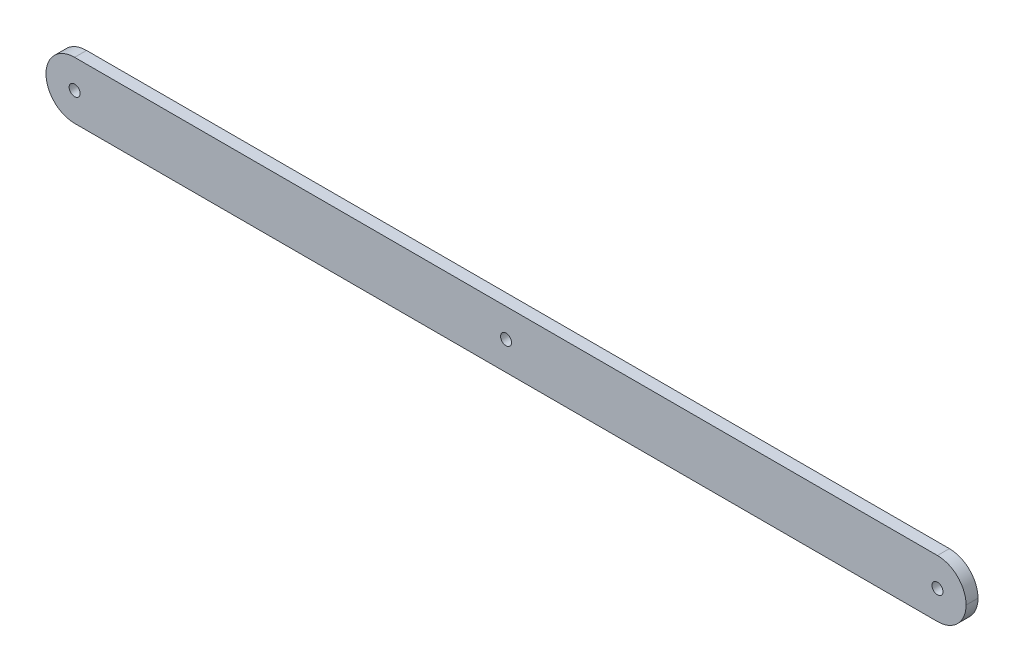
ISO-10303-21;
HEADER;
FILE_DESCRIPTION(('STEP AP214'),'2;1');
FILE_NAME('part.step','',(''),(''),'','','');
FILE_SCHEMA(('AUTOMOTIVE_DESIGN { 1 0 10303 214 1 1 1 1 }'));
ENDSEC;
DATA;
#1=APPLICATION_CONTEXT('core data for automotive mechanical design processes');
#2=APPLICATION_PROTOCOL_DEFINITION('international standard','automotive_design',2000,#1);
#3=PRODUCT_CONTEXT('',#1,'mechanical');
#4=PRODUCT('Part','Part','',(#3));
#5=PRODUCT_RELATED_PRODUCT_CATEGORY('part','',(#4));
#6=PRODUCT_DEFINITION_FORMATION('','',#4);
#7=PRODUCT_DEFINITION_CONTEXT('part definition',#1,'design');
#8=PRODUCT_DEFINITION('design','',#6,#7);
#9=PRODUCT_DEFINITION_SHAPE('','',#8);
#10=(LENGTH_UNIT() NAMED_UNIT(*) SI_UNIT(.MILLI.,.METRE.));
#11=(NAMED_UNIT(*) PLANE_ANGLE_UNIT() SI_UNIT($,.RADIAN.));
#12=(NAMED_UNIT(*) SI_UNIT($,.STERADIAN.) SOLID_ANGLE_UNIT());
#13=UNCERTAINTY_MEASURE_WITH_UNIT(LENGTH_MEASURE(1.E-05),#10,'distance_accuracy_value','');
#14=(GEOMETRIC_REPRESENTATION_CONTEXT(3) GLOBAL_UNCERTAINTY_ASSIGNED_CONTEXT((#13)) GLOBAL_UNIT_ASSIGNED_CONTEXT((#10,
#11,#12)) REPRESENTATION_CONTEXT('',''));
#15=CARTESIAN_POINT('',(0.,0.,0.));
#16=DIRECTION('',(0.,0.,1.));
#17=DIRECTION('',(1.,0.,0.));
#18=AXIS2_PLACEMENT_3D('',#15,#16,#17);
#19=CARTESIAN_POINT('',(-122.555,7.62,3.175));
#20=DIRECTION('',(0.,-1.,0.));
#21=DIRECTION('',(0.,0.,-1.));
#22=AXIS2_PLACEMENT_3D('',#19,#20,#21);
#23=PLANE('',#22);
#24=DIRECTION('',(-1.,0.,0.));
#25=VECTOR('',#24,1.);
#26=CARTESIAN_POINT('',(-122.555,7.62,0.));
#27=LINE('',#26,#25);
#28=CARTESIAN_POINT('',(114.935,7.62,0.));
#29=VERTEX_POINT('',#28);
#30=CARTESIAN_POINT('',(-114.935,7.62,0.));
#31=VERTEX_POINT('',#30);
#32=EDGE_CURVE('E125',#29,#31,#27,.T.);
#33=ORIENTED_EDGE('',*,*,#32,.T.);
#34=DIRECTION('',(0.,0.,-1.));
#35=VECTOR('',#34,1.);
#36=CARTESIAN_POINT('',(-114.935,7.62,3.175));
#37=LINE('',#36,#35);
#38=CARTESIAN_POINT('',(-114.935,7.62,3.175));
#39=VERTEX_POINT('',#38);
#40=EDGE_CURVE('E11',#31,#39,#37,.F.);
#41=ORIENTED_EDGE('',*,*,#40,.T.);
#42=DIRECTION('',(-1.,0.,0.));
#43=VECTOR('',#42,1.);
#44=CARTESIAN_POINT('',(-122.555,7.62,3.175));
#45=LINE('',#44,#43);
#46=CARTESIAN_POINT('',(114.935,7.62,3.175));
#47=VERTEX_POINT('',#46);
#48=EDGE_CURVE('E121',#47,#39,#45,.T.);
#49=ORIENTED_EDGE('',*,*,#48,.F.);
#50=DIRECTION('',(0.,0.,-1.));
#51=VECTOR('',#50,1.);
#52=CARTESIAN_POINT('',(114.935,7.62,3.175));
#53=LINE('',#52,#51);
#54=EDGE_CURVE('E48',#47,#29,#53,.T.);
#55=ORIENTED_EDGE('',*,*,#54,.T.);
#56=EDGE_LOOP('',(#33,#41,#49,#55));
#57=FACE_BOUND('',#56,.T.);
#58=ADVANCED_FACE('F39',(#57),#23,.F.);
#59=CARTESIAN_POINT('',(-122.555,-7.62,3.175));
#60=DIRECTION('',(0.,1.,0.));
#61=DIRECTION('',(0.,0.,1.));
#62=AXIS2_PLACEMENT_3D('',#59,#60,#61);
#63=PLANE('',#62);
#64=DIRECTION('',(1.,0.,0.));
#65=VECTOR('',#64,1.);
#66=CARTESIAN_POINT('',(-122.555,-7.62,3.175));
#67=LINE('',#66,#65);
#68=CARTESIAN_POINT('',(-114.935,-7.62,3.175));
#69=VERTEX_POINT('',#68);
#70=CARTESIAN_POINT('',(114.935,-7.62,3.175));
#71=VERTEX_POINT('',#70);
#72=EDGE_CURVE('E111',#69,#71,#67,.T.);
#73=ORIENTED_EDGE('',*,*,#72,.F.);
#74=DIRECTION('',(0.,0.,-1.));
#75=VECTOR('',#74,1.);
#76=CARTESIAN_POINT('',(-114.935,-7.62,3.175));
#77=LINE('',#76,#75);
#78=CARTESIAN_POINT('',(-114.935,-7.62,0.));
#79=VERTEX_POINT('',#78);
#80=EDGE_CURVE('E98',#69,#79,#77,.T.);
#81=ORIENTED_EDGE('',*,*,#80,.T.);
#82=DIRECTION('',(1.,0.,0.));
#83=VECTOR('',#82,1.);
#84=CARTESIAN_POINT('',(-122.555,-7.62,0.));
#85=LINE('',#84,#83);
#86=CARTESIAN_POINT('',(114.935,-7.62,0.));
#87=VERTEX_POINT('',#86);
#88=EDGE_CURVE('E112',#79,#87,#85,.T.);
#89=ORIENTED_EDGE('',*,*,#88,.T.);
#90=DIRECTION('',(0.,0.,-1.));
#91=VECTOR('',#90,1.);
#92=CARTESIAN_POINT('',(114.935,-7.62,3.175));
#93=LINE('',#92,#91);
#94=EDGE_CURVE('E117',#87,#71,#93,.F.);
#95=ORIENTED_EDGE('',*,*,#94,.T.);
#96=EDGE_LOOP('',(#73,#81,#89,#95));
#97=FACE_BOUND('',#96,.T.);
#98=ADVANCED_FACE('F108',(#97),#63,.F.);
#99=CARTESIAN_POINT('',(0.,0.,3.175));
#100=DIRECTION('',(0.,0.,-1.));
#101=DIRECTION('',(-1.,0.,0.));
#102=AXIS2_PLACEMENT_3D('',#99,#100,#101);
#103=PLANE('',#102);
#104=CARTESIAN_POINT('',(-114.935,0.,3.175));
#105=DIRECTION('',(0.,0.,1.));
#106=DIRECTION('',(1.,0.,0.));
#107=AXIS2_PLACEMENT_3D('',#104,#105,#106);
#108=CIRCLE('',#107,1.4605);
#109=CARTESIAN_POINT('',(-113.4745,0.,3.175));
#110=VERTEX_POINT('',#109);
#111=EDGE_CURVE('E141',#110,#110,#108,.T.);
#112=ORIENTED_EDGE('',*,*,#111,.F.);
#113=EDGE_LOOP('',(#112));
#114=FACE_BOUND('',#113,.T.);
#115=CARTESIAN_POINT('',(114.935,0.,3.175));
#116=DIRECTION('',(0.,0.,1.));
#117=DIRECTION('',(1.,0.,0.));
#118=AXIS2_PLACEMENT_3D('',#115,#116,#117);
#119=CIRCLE('',#118,1.4605);
#120=CARTESIAN_POINT('',(116.3955,0.,3.175));
#121=VERTEX_POINT('',#120);
#122=EDGE_CURVE('E146',#121,#121,#119,.T.);
#123=ORIENTED_EDGE('',*,*,#122,.F.);
#124=EDGE_LOOP('',(#123));
#125=FACE_BOUND('',#124,.T.);
#126=CARTESIAN_POINT('',(0.,0.,3.175));
#127=DIRECTION('',(0.,0.,1.));
#128=DIRECTION('',(1.,0.,0.));
#129=AXIS2_PLACEMENT_3D('',#126,#127,#128);
#130=CIRCLE('',#129,1.4605);
#131=CARTESIAN_POINT('',(1.4605,0.,3.175));
#132=VERTEX_POINT('',#131);
#133=EDGE_CURVE('E156',#132,#132,#130,.T.);
#134=ORIENTED_EDGE('',*,*,#133,.F.);
#135=EDGE_LOOP('',(#134));
#136=FACE_BOUND('',#135,.T.);
#137=CARTESIAN_POINT('',(-114.935,0.,3.175));
#138=DIRECTION('',(0.,0.,-1.));
#139=DIRECTION('',(-1.,0.,0.));
#140=AXIS2_PLACEMENT_3D('',#137,#138,#139);
#141=CIRCLE('',#140,7.62);
#142=CARTESIAN_POINT('',(-122.555,0.,3.175));
#143=VERTEX_POINT('',#142);
#144=EDGE_CURVE('E57',#39,#143,#141,.F.);
#145=ORIENTED_EDGE('',*,*,#144,.T.);
#146=CARTESIAN_POINT('',(-114.935,0.,3.175));
#147=DIRECTION('',(0.,0.,-1.));
#148=DIRECTION('',(-1.,0.,0.));
#149=AXIS2_PLACEMENT_3D('',#146,#147,#148);
#150=CIRCLE('',#149,7.62);
#151=EDGE_CURVE('E136',#143,#69,#150,.F.);
#152=ORIENTED_EDGE('',*,*,#151,.T.);
#153=ORIENTED_EDGE('',*,*,#72,.T.);
#154=CARTESIAN_POINT('',(114.935,0.,3.175));
#155=DIRECTION('',(0.,0.,-1.));
#156=DIRECTION('',(-1.,0.,0.));
#157=AXIS2_PLACEMENT_3D('',#154,#155,#156);
#158=CIRCLE('',#157,7.62);
#159=CARTESIAN_POINT('',(122.555,0.,3.175));
#160=VERTEX_POINT('',#159);
#161=EDGE_CURVE('E133',#71,#160,#158,.F.);
#162=ORIENTED_EDGE('',*,*,#161,.T.);
#163=CARTESIAN_POINT('',(114.935,0.,3.175));
#164=DIRECTION('',(0.,0.,-1.));
#165=DIRECTION('',(-1.,0.,0.));
#166=AXIS2_PLACEMENT_3D('',#163,#164,#165);
#167=CIRCLE('',#166,7.62);
#168=EDGE_CURVE('E103',#160,#47,#167,.F.);
#169=ORIENTED_EDGE('',*,*,#168,.T.);
#170=ORIENTED_EDGE('',*,*,#48,.T.);
#171=EDGE_LOOP('',(#145,#152,#153,#162,#169,#170));
#172=FACE_BOUND('',#171,.T.);
#173=ADVANCED_FACE('F161',(#114,#125,#136,#172),#103,.F.);
#174=CARTESIAN_POINT('',(0.,0.,0.));
#175=DIRECTION('',(0.,0.,-1.));
#176=DIRECTION('',(-1.,0.,0.));
#177=AXIS2_PLACEMENT_3D('',#174,#175,#176);
#178=PLANE('',#177);
#179=CARTESIAN_POINT('',(-114.935,0.,0.));
#180=DIRECTION('',(0.,0.,1.));
#181=DIRECTION('',(1.,0.,0.));
#182=AXIS2_PLACEMENT_3D('',#179,#180,#181);
#183=CIRCLE('',#182,1.4605);
#184=CARTESIAN_POINT('',(-113.4745,0.,0.));
#185=VERTEX_POINT('',#184);
#186=EDGE_CURVE('E138',#185,#185,#183,.T.);
#187=ORIENTED_EDGE('',*,*,#186,.T.);
#188=EDGE_LOOP('',(#187));
#189=FACE_BOUND('',#188,.T.);
#190=CARTESIAN_POINT('',(114.935,0.,0.));
#191=DIRECTION('',(0.,0.,1.));
#192=DIRECTION('',(1.,0.,0.));
#193=AXIS2_PLACEMENT_3D('',#190,#191,#192);
#194=CIRCLE('',#193,1.4605);
#195=CARTESIAN_POINT('',(116.3955,0.,0.));
#196=VERTEX_POINT('',#195);
#197=EDGE_CURVE('E153',#196,#196,#194,.T.);
#198=ORIENTED_EDGE('',*,*,#197,.T.);
#199=EDGE_LOOP('',(#198));
#200=FACE_BOUND('',#199,.T.);
#201=CARTESIAN_POINT('',(0.,0.,0.));
#202=DIRECTION('',(0.,0.,1.));
#203=DIRECTION('',(1.,0.,0.));
#204=AXIS2_PLACEMENT_3D('',#201,#202,#203);
#205=CIRCLE('',#204,1.4605);
#206=CARTESIAN_POINT('',(1.4605,0.,0.));
#207=VERTEX_POINT('',#206);
#208=EDGE_CURVE('E157',#207,#207,#205,.T.);
#209=ORIENTED_EDGE('',*,*,#208,.T.);
#210=EDGE_LOOP('',(#209));
#211=FACE_BOUND('',#210,.T.);
#212=ORIENTED_EDGE('',*,*,#88,.F.);
#213=CARTESIAN_POINT('',(-114.935,0.,0.));
#214=DIRECTION('',(0.,0.,-1.));
#215=DIRECTION('',(-1.,0.,0.));
#216=AXIS2_PLACEMENT_3D('',#213,#214,#215);
#217=CIRCLE('',#216,7.62);
#218=CARTESIAN_POINT('',(-122.555,0.,0.));
#219=VERTEX_POINT('',#218);
#220=EDGE_CURVE('E94',#79,#219,#217,.T.);
#221=ORIENTED_EDGE('',*,*,#220,.T.);
#222=CARTESIAN_POINT('',(-114.935,0.,0.));
#223=DIRECTION('',(0.,0.,-1.));
#224=DIRECTION('',(-1.,0.,0.));
#225=AXIS2_PLACEMENT_3D('',#222,#223,#224);
#226=CIRCLE('',#225,7.62);
#227=EDGE_CURVE('E102',#219,#31,#226,.T.);
#228=ORIENTED_EDGE('',*,*,#227,.T.);
#229=ORIENTED_EDGE('',*,*,#32,.F.);
#230=CARTESIAN_POINT('',(114.935,0.,0.));
#231=DIRECTION('',(0.,0.,-1.));
#232=DIRECTION('',(-1.,0.,0.));
#233=AXIS2_PLACEMENT_3D('',#230,#231,#232);
#234=CIRCLE('',#233,7.62);
#235=CARTESIAN_POINT('',(122.555,0.,0.));
#236=VERTEX_POINT('',#235);
#237=EDGE_CURVE('E113',#29,#236,#234,.T.);
#238=ORIENTED_EDGE('',*,*,#237,.T.);
#239=CARTESIAN_POINT('',(114.935,0.,0.));
#240=DIRECTION('',(0.,0.,-1.));
#241=DIRECTION('',(-1.,0.,0.));
#242=AXIS2_PLACEMENT_3D('',#239,#240,#241);
#243=CIRCLE('',#242,7.62);
#244=EDGE_CURVE('E116',#236,#87,#243,.T.);
#245=ORIENTED_EDGE('',*,*,#244,.T.);
#246=EDGE_LOOP('',(#212,#221,#228,#229,#238,#245));
#247=FACE_BOUND('',#246,.T.);
#248=ADVANCED_FACE('F118',(#189,#200,#211,#247),#178,.T.);
#249=CARTESIAN_POINT('',(-114.935,0.,3.175));
#250=DIRECTION('',(0.,0.,-1.));
#251=DIRECTION('',(-1.,0.,0.));
#252=AXIS2_PLACEMENT_3D('',#249,#250,#251);
#253=CYLINDRICAL_SURFACE('',#252,7.62);
#254=DIRECTION('',(0.,0.,-1.));
#255=VECTOR('',#254,1.);
#256=CARTESIAN_POINT('',(-122.555,0.,3.175));
#257=LINE('',#256,#255);
#258=EDGE_CURVE('E97',#143,#219,#257,.T.);
#259=ORIENTED_EDGE('',*,*,#258,.F.);
#260=ORIENTED_EDGE('',*,*,#144,.F.);
#261=ORIENTED_EDGE('',*,*,#40,.F.);
#262=ORIENTED_EDGE('',*,*,#227,.F.);
#263=EDGE_LOOP('',(#259,#260,#261,#262));
#264=FACE_BOUND('',#263,.T.);
#265=ADVANCED_FACE('F169',(#264),#253,.T.);
#266=CARTESIAN_POINT('',(-114.935,0.,3.175));
#267=DIRECTION('',(0.,0.,-1.));
#268=DIRECTION('',(-1.,0.,0.));
#269=AXIS2_PLACEMENT_3D('',#266,#267,#268);
#270=CYLINDRICAL_SURFACE('',#269,7.62);
#271=ORIENTED_EDGE('',*,*,#151,.F.);
#272=ORIENTED_EDGE('',*,*,#258,.T.);
#273=ORIENTED_EDGE('',*,*,#220,.F.);
#274=ORIENTED_EDGE('',*,*,#80,.F.);
#275=EDGE_LOOP('',(#271,#272,#273,#274));
#276=FACE_BOUND('',#275,.T.);
#277=ADVANCED_FACE('F100',(#276),#270,.T.);
#278=CARTESIAN_POINT('',(114.935,0.,3.175));
#279=DIRECTION('',(0.,0.,-1.));
#280=DIRECTION('',(-1.,0.,0.));
#281=AXIS2_PLACEMENT_3D('',#278,#279,#280);
#282=CYLINDRICAL_SURFACE('',#281,7.62);
#283=ORIENTED_EDGE('',*,*,#54,.F.);
#284=ORIENTED_EDGE('',*,*,#168,.F.);
#285=DIRECTION('',(0.,0.,-1.));
#286=VECTOR('',#285,1.);
#287=CARTESIAN_POINT('',(122.555,0.,3.175));
#288=LINE('',#287,#286);
#289=EDGE_CURVE('E43',#236,#160,#288,.F.);
#290=ORIENTED_EDGE('',*,*,#289,.F.);
#291=ORIENTED_EDGE('',*,*,#237,.F.);
#292=EDGE_LOOP('',(#283,#284,#290,#291));
#293=FACE_BOUND('',#292,.T.);
#294=ADVANCED_FACE('F41',(#293),#282,.T.);
#295=CARTESIAN_POINT('',(114.935,0.,3.175));
#296=DIRECTION('',(0.,0.,-1.));
#297=DIRECTION('',(-1.,0.,0.));
#298=AXIS2_PLACEMENT_3D('',#295,#296,#297);
#299=CYLINDRICAL_SURFACE('',#298,7.62);
#300=ORIENTED_EDGE('',*,*,#161,.F.);
#301=ORIENTED_EDGE('',*,*,#94,.F.);
#302=ORIENTED_EDGE('',*,*,#244,.F.);
#303=ORIENTED_EDGE('',*,*,#289,.T.);
#304=EDGE_LOOP('',(#300,#301,#302,#303));
#305=FACE_BOUND('',#304,.T.);
#306=ADVANCED_FACE('F191',(#305),#299,.T.);
#307=CARTESIAN_POINT('',(0.,0.,0.));
#308=DIRECTION('',(0.,0.,1.));
#309=DIRECTION('',(1.,0.,0.));
#310=AXIS2_PLACEMENT_3D('',#307,#308,#309);
#311=CYLINDRICAL_SURFACE('',#310,1.4605);
#312=ORIENTED_EDGE('',*,*,#208,.F.);
#313=EDGE_LOOP('',(#312));
#314=FACE_BOUND('',#313,.T.);
#315=ORIENTED_EDGE('',*,*,#133,.T.);
#316=EDGE_LOOP('',(#315));
#317=FACE_BOUND('',#316,.T.);
#318=ADVANCED_FACE('F190',(#314,#317),#311,.F.);
#319=CARTESIAN_POINT('',(114.935,0.,0.));
#320=DIRECTION('',(0.,0.,1.));
#321=DIRECTION('',(1.,0.,0.));
#322=AXIS2_PLACEMENT_3D('',#319,#320,#321);
#323=CYLINDRICAL_SURFACE('',#322,1.4605);
#324=ORIENTED_EDGE('',*,*,#197,.F.);
#325=EDGE_LOOP('',(#324));
#326=FACE_BOUND('',#325,.T.);
#327=ORIENTED_EDGE('',*,*,#122,.T.);
#328=EDGE_LOOP('',(#327));
#329=FACE_BOUND('',#328,.T.);
#330=ADVANCED_FACE('F186',(#326,#329),#323,.F.);
#331=CARTESIAN_POINT('',(-114.935,0.,0.));
#332=DIRECTION('',(0.,0.,1.));
#333=DIRECTION('',(1.,0.,0.));
#334=AXIS2_PLACEMENT_3D('',#331,#332,#333);
#335=CYLINDRICAL_SURFACE('',#334,1.4605);
#336=ORIENTED_EDGE('',*,*,#186,.F.);
#337=EDGE_LOOP('',(#336));
#338=FACE_BOUND('',#337,.T.);
#339=ORIENTED_EDGE('',*,*,#111,.T.);
#340=EDGE_LOOP('',(#339));
#341=FACE_BOUND('',#340,.T.);
#342=ADVANCED_FACE('F194',(#338,#341),#335,.F.);
#343=CLOSED_SHELL('',(#58,#98,#173,#248,#265,#277,#294,#306,#318,#330,#342));
#344=MANIFOLD_SOLID_BREP('B2',#343);
#345=ADVANCED_BREP_SHAPE_REPRESENTATION('',(#18,#344),#14);
#346=SHAPE_DEFINITION_REPRESENTATION(#9,#345);
ENDSEC;
END-ISO-10303-21;
